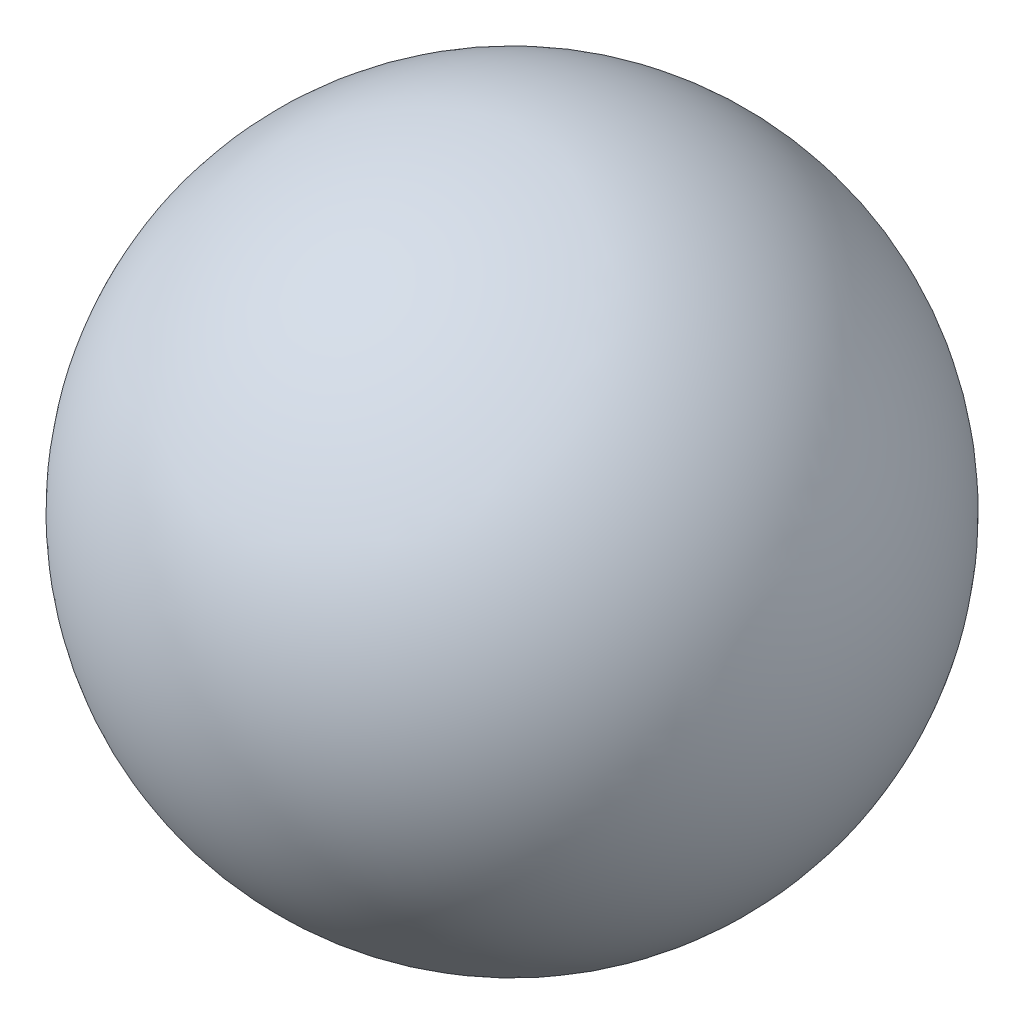
ISO-10303-21;
HEADER;
FILE_DESCRIPTION(('STEP AP214'),'2;1');
FILE_NAME('part.step','',(''),(''),'','','');
FILE_SCHEMA(('AUTOMOTIVE_DESIGN { 1 0 10303 214 1 1 1 1 }'));
ENDSEC;
DATA;
#1=APPLICATION_CONTEXT('core data for automotive mechanical design processes');
#2=APPLICATION_PROTOCOL_DEFINITION('international standard','automotive_design',2000,#1);
#3=PRODUCT_CONTEXT('',#1,'mechanical');
#4=PRODUCT('Part','Part','',(#3));
#5=PRODUCT_RELATED_PRODUCT_CATEGORY('part','',(#4));
#6=PRODUCT_DEFINITION_FORMATION('','',#4);
#7=PRODUCT_DEFINITION_CONTEXT('part definition',#1,'design');
#8=PRODUCT_DEFINITION('design','',#6,#7);
#9=PRODUCT_DEFINITION_SHAPE('','',#8);
#10=(LENGTH_UNIT() NAMED_UNIT(*) SI_UNIT(.MILLI.,.METRE.));
#11=(NAMED_UNIT(*) PLANE_ANGLE_UNIT() SI_UNIT($,.RADIAN.));
#12=(NAMED_UNIT(*) SI_UNIT($,.STERADIAN.) SOLID_ANGLE_UNIT());
#13=UNCERTAINTY_MEASURE_WITH_UNIT(LENGTH_MEASURE(1.E-05),#10,'distance_accuracy_value','');
#14=(GEOMETRIC_REPRESENTATION_CONTEXT(3) GLOBAL_UNCERTAINTY_ASSIGNED_CONTEXT((#13)) GLOBAL_UNIT_ASSIGNED_CONTEXT((#10,
#11,#12)) REPRESENTATION_CONTEXT('',''));
#15=CARTESIAN_POINT('',(0.,0.,0.));
#16=DIRECTION('',(0.,0.,1.));
#17=DIRECTION('',(1.,0.,0.));
#18=AXIS2_PLACEMENT_3D('',#15,#16,#17);
#19=CARTESIAN_POINT('',(0.,0.,0.));
#20=DIRECTION('',(1.,0.,0.));
#21=DIRECTION('',(0.,-1.,0.));
#22=AXIS2_PLACEMENT_3D('',#19,#20,#21);
#23=SPHERICAL_SURFACE('',#22,21.25);
#24=CARTESIAN_POINT('',(21.25,0.,0.));
#25=VERTEX_POINT('',#24);
#26=VERTEX_LOOP('',#25);
#27=FACE_BOUND('',#26,.T.);
#28=ADVANCED_FACE('F34',(#27),#23,.T.);
#29=CLOSED_SHELL('',(#28));
#30=MANIFOLD_SOLID_BREP('B2',#29);
#31=ADVANCED_BREP_SHAPE_REPRESENTATION('',(#18,#30),#14);
#32=SHAPE_DEFINITION_REPRESENTATION(#9,#31);
ENDSEC;
END-ISO-10303-21;
